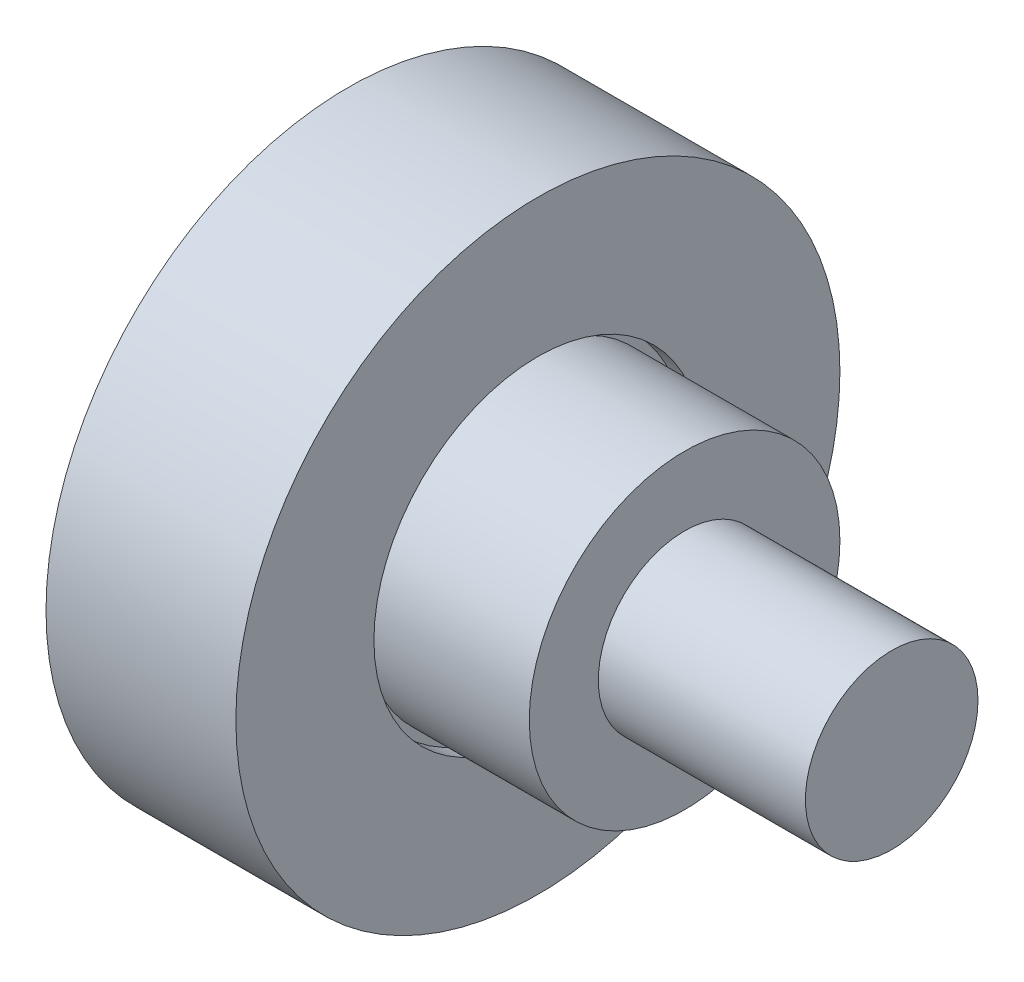
ISO-10303-21;
HEADER;
FILE_DESCRIPTION(('STEP AP214'),'2;1');
FILE_NAME('part.step','',(''),(''),'','','');
FILE_SCHEMA(('AUTOMOTIVE_DESIGN { 1 0 10303 214 1 1 1 1 }'));
ENDSEC;
DATA;
#1=APPLICATION_CONTEXT('core data for automotive mechanical design processes');
#2=APPLICATION_PROTOCOL_DEFINITION('international standard','automotive_design',2000,#1);
#3=PRODUCT_CONTEXT('',#1,'mechanical');
#4=PRODUCT('Part','Part','',(#3));
#5=PRODUCT_RELATED_PRODUCT_CATEGORY('part','',(#4));
#6=PRODUCT_DEFINITION_FORMATION('','',#4);
#7=PRODUCT_DEFINITION_CONTEXT('part definition',#1,'design');
#8=PRODUCT_DEFINITION('design','',#6,#7);
#9=PRODUCT_DEFINITION_SHAPE('','',#8);
#10=(LENGTH_UNIT() NAMED_UNIT(*) SI_UNIT(.MILLI.,.METRE.));
#11=(NAMED_UNIT(*) PLANE_ANGLE_UNIT() SI_UNIT($,.RADIAN.));
#12=(NAMED_UNIT(*) SI_UNIT($,.STERADIAN.) SOLID_ANGLE_UNIT());
#13=UNCERTAINTY_MEASURE_WITH_UNIT(LENGTH_MEASURE(1.E-05),#10,'distance_accuracy_value','');
#14=(GEOMETRIC_REPRESENTATION_CONTEXT(3) GLOBAL_UNCERTAINTY_ASSIGNED_CONTEXT((#13)) GLOBAL_UNIT_ASSIGNED_CONTEXT((#10,
#11,#12)) REPRESENTATION_CONTEXT('',''));
#15=CARTESIAN_POINT('',(0.,0.,0.));
#16=DIRECTION('',(0.,0.,1.));
#17=DIRECTION('',(1.,0.,0.));
#18=AXIS2_PLACEMENT_3D('',#15,#16,#17);
#19=CARTESIAN_POINT('',(39.,0.,0.));
#20=DIRECTION('',(1.,0.,0.));
#21=DIRECTION('',(0.,0.,-1.));
#22=AXIS2_PLACEMENT_3D('',#19,#20,#21);
#23=PLANE('',#22);
#24=CARTESIAN_POINT('',(39.,0.,0.));
#25=DIRECTION('',(1.,0.,0.));
#26=DIRECTION('',(0.,0.,-1.));
#27=AXIS2_PLACEMENT_3D('',#24,#25,#26);
#28=CIRCLE('',#27,18.);
#29=CARTESIAN_POINT('',(39.,0.,-18.));
#30=VERTEX_POINT('',#29);
#31=EDGE_CURVE('E45',#30,#30,#28,.T.);
#32=ORIENTED_EDGE('',*,*,#31,.T.);
#33=EDGE_LOOP('',(#32));
#34=FACE_BOUND('',#33,.T.);
#35=CARTESIAN_POINT('',(39.,0.,0.));
#36=DIRECTION('',(1.,0.,0.));
#37=DIRECTION('',(0.,0.,-1.));
#38=AXIS2_PLACEMENT_3D('',#35,#36,#37);
#39=CIRCLE('',#38,10.);
#40=CARTESIAN_POINT('',(39.,0.,-10.));
#41=VERTEX_POINT('',#40);
#42=EDGE_CURVE('E50',#41,#41,#39,.T.);
#43=ORIENTED_EDGE('',*,*,#42,.F.);
#44=EDGE_LOOP('',(#43));
#45=FACE_BOUND('',#44,.T.);
#46=ADVANCED_FACE('F34',(#34,#45),#23,.T.);
#47=CARTESIAN_POINT('',(39.,0.,0.));
#48=DIRECTION('',(-1.,0.,0.));
#49=DIRECTION('',(0.,0.,1.));
#50=AXIS2_PLACEMENT_3D('',#47,#48,#49);
#51=CYLINDRICAL_SURFACE('',#50,18.);
#52=ORIENTED_EDGE('',*,*,#31,.F.);
#53=EDGE_LOOP('',(#52));
#54=FACE_BOUND('',#53,.T.);
#55=CARTESIAN_POINT('',(20.,0.,0.));
#56=DIRECTION('',(1.,0.,0.));
#57=DIRECTION('',(0.,0.,-1.));
#58=AXIS2_PLACEMENT_3D('',#55,#56,#57);
#59=CIRCLE('',#58,18.);
#60=CARTESIAN_POINT('',(20.,0.,-18.));
#61=VERTEX_POINT('',#60);
#62=EDGE_CURVE('E59',#61,#61,#59,.T.);
#63=ORIENTED_EDGE('',*,*,#62,.T.);
#64=EDGE_LOOP('',(#63));
#65=FACE_BOUND('',#64,.T.);
#66=ADVANCED_FACE('F65',(#54,#65),#51,.T.);
#67=CARTESIAN_POINT('',(63.,0.,0.));
#68=DIRECTION('',(-1.,0.,0.));
#69=DIRECTION('',(0.,0.,1.));
#70=AXIS2_PLACEMENT_3D('',#67,#68,#69);
#71=CYLINDRICAL_SURFACE('',#70,10.);
#72=CARTESIAN_POINT('',(63.,0.,0.));
#73=DIRECTION('',(1.,0.,0.));
#74=DIRECTION('',(0.,0.,-1.));
#75=AXIS2_PLACEMENT_3D('',#72,#73,#74);
#76=CIRCLE('',#75,10.);
#77=CARTESIAN_POINT('',(63.,0.,-10.));
#78=VERTEX_POINT('',#77);
#79=EDGE_CURVE('E49',#78,#78,#76,.T.);
#80=ORIENTED_EDGE('',*,*,#79,.F.);
#81=EDGE_LOOP('',(#80));
#82=FACE_BOUND('',#81,.T.);
#83=ORIENTED_EDGE('',*,*,#42,.T.);
#84=EDGE_LOOP('',(#83));
#85=FACE_BOUND('',#84,.T.);
#86=ADVANCED_FACE('F95',(#82,#85),#71,.T.);
#87=CARTESIAN_POINT('',(63.,0.,0.));
#88=DIRECTION('',(1.,0.,0.));
#89=DIRECTION('',(0.,0.,-1.));
#90=AXIS2_PLACEMENT_3D('',#87,#88,#89);
#91=PLANE('',#90);
#92=ORIENTED_EDGE('',*,*,#79,.T.);
#93=EDGE_LOOP('',(#92));
#94=FACE_BOUND('',#93,.T.);
#95=ADVANCED_FACE('F77',(#94),#91,.T.);
#96=CARTESIAN_POINT('',(20.,0.,0.));
#97=DIRECTION('',(1.,0.,0.));
#98=DIRECTION('',(0.,0.,-1.));
#99=AXIS2_PLACEMENT_3D('',#96,#97,#98);
#100=CYLINDRICAL_SURFACE('',#99,19.);
#101=CARTESIAN_POINT('',(20.,0.,0.));
#102=DIRECTION('',(1.,0.,0.));
#103=DIRECTION('',(0.,0.,-1.));
#104=AXIS2_PLACEMENT_3D('',#101,#102,#103);
#105=CIRCLE('',#104,19.);
#106=CARTESIAN_POINT('',(20.,0.,-19.));
#107=VERTEX_POINT('',#106);
#108=EDGE_CURVE('E53',#107,#107,#105,.T.);
#109=ORIENTED_EDGE('',*,*,#108,.F.);
#110=EDGE_LOOP('',(#109));
#111=FACE_BOUND('',#110,.T.);
#112=CARTESIAN_POINT('',(22.,0.,0.));
#113=DIRECTION('',(1.,0.,0.));
#114=DIRECTION('',(0.,0.,-1.));
#115=AXIS2_PLACEMENT_3D('',#112,#113,#114);
#116=CIRCLE('',#115,19.);
#117=CARTESIAN_POINT('',(22.,0.,-19.));
#118=VERTEX_POINT('',#117);
#119=EDGE_CURVE('E56',#118,#118,#116,.T.);
#120=ORIENTED_EDGE('',*,*,#119,.T.);
#121=EDGE_LOOP('',(#120));
#122=FACE_BOUND('',#121,.T.);
#123=ADVANCED_FACE('F71',(#111,#122),#100,.F.);
#124=CARTESIAN_POINT('',(20.,0.,0.));
#125=DIRECTION('',(1.,0.,0.));
#126=DIRECTION('',(0.,0.,-1.));
#127=AXIS2_PLACEMENT_3D('',#124,#125,#126);
#128=PLANE('',#127);
#129=ORIENTED_EDGE('',*,*,#62,.F.);
#130=EDGE_LOOP('',(#129));
#131=FACE_BOUND('',#130,.T.);
#132=ORIENTED_EDGE('',*,*,#108,.T.);
#133=EDGE_LOOP('',(#132));
#134=FACE_BOUND('',#133,.T.);
#135=ADVANCED_FACE('F67',(#131,#134),#128,.T.);
#136=CARTESIAN_POINT('',(0.,0.,0.));
#137=DIRECTION('',(1.,0.,0.));
#138=DIRECTION('',(0.,0.,-1.));
#139=AXIS2_PLACEMENT_3D('',#136,#137,#138);
#140=PLANE('',#139);
#141=CARTESIAN_POINT('',(0.,0.,0.));
#142=DIRECTION('',(1.,0.,0.));
#143=DIRECTION('',(0.,0.,-1.));
#144=AXIS2_PLACEMENT_3D('',#141,#142,#143);
#145=CIRCLE('',#144,35.);
#146=CARTESIAN_POINT('',(0.,0.,-35.));
#147=VERTEX_POINT('',#146);
#148=EDGE_CURVE('E38',#147,#147,#145,.T.);
#149=ORIENTED_EDGE('',*,*,#148,.F.);
#150=EDGE_LOOP('',(#149));
#151=FACE_BOUND('',#150,.T.);
#152=ADVANCED_FACE('F70',(#151),#140,.F.);
#153=CARTESIAN_POINT('',(22.,0.,0.));
#154=DIRECTION('',(-1.,0.,0.));
#155=DIRECTION('',(0.,0.,1.));
#156=AXIS2_PLACEMENT_3D('',#153,#154,#155);
#157=CYLINDRICAL_SURFACE('',#156,35.);
#158=CARTESIAN_POINT('',(22.,0.,0.));
#159=DIRECTION('',(1.,0.,0.));
#160=DIRECTION('',(0.,0.,-1.));
#161=AXIS2_PLACEMENT_3D('',#158,#159,#160);
#162=CIRCLE('',#161,35.);
#163=CARTESIAN_POINT('',(22.,0.,-35.));
#164=VERTEX_POINT('',#163);
#165=EDGE_CURVE('E10',#164,#164,#162,.T.);
#166=ORIENTED_EDGE('',*,*,#165,.F.);
#167=EDGE_LOOP('',(#166));
#168=FACE_BOUND('',#167,.T.);
#169=ORIENTED_EDGE('',*,*,#148,.T.);
#170=EDGE_LOOP('',(#169));
#171=FACE_BOUND('',#170,.T.);
#172=ADVANCED_FACE('F36',(#168,#171),#157,.T.);
#173=CARTESIAN_POINT('',(22.,0.,0.));
#174=DIRECTION('',(1.,0.,0.));
#175=DIRECTION('',(0.,0.,-1.));
#176=AXIS2_PLACEMENT_3D('',#173,#174,#175);
#177=PLANE('',#176);
#178=ORIENTED_EDGE('',*,*,#119,.F.);
#179=EDGE_LOOP('',(#178));
#180=FACE_BOUND('',#179,.T.);
#181=ORIENTED_EDGE('',*,*,#165,.T.);
#182=EDGE_LOOP('',(#181));
#183=FACE_BOUND('',#182,.T.);
#184=ADVANCED_FACE('F81',(#180,#183),#177,.T.);
#185=CLOSED_SHELL('',(#46,#66,#86,#95,#123,#135,#152,#172,#184));
#186=MANIFOLD_SOLID_BREP('B2',#185);
#187=ADVANCED_BREP_SHAPE_REPRESENTATION('',(#18,#186),#14);
#188=SHAPE_DEFINITION_REPRESENTATION(#9,#187);
ENDSEC;
END-ISO-10303-21;
